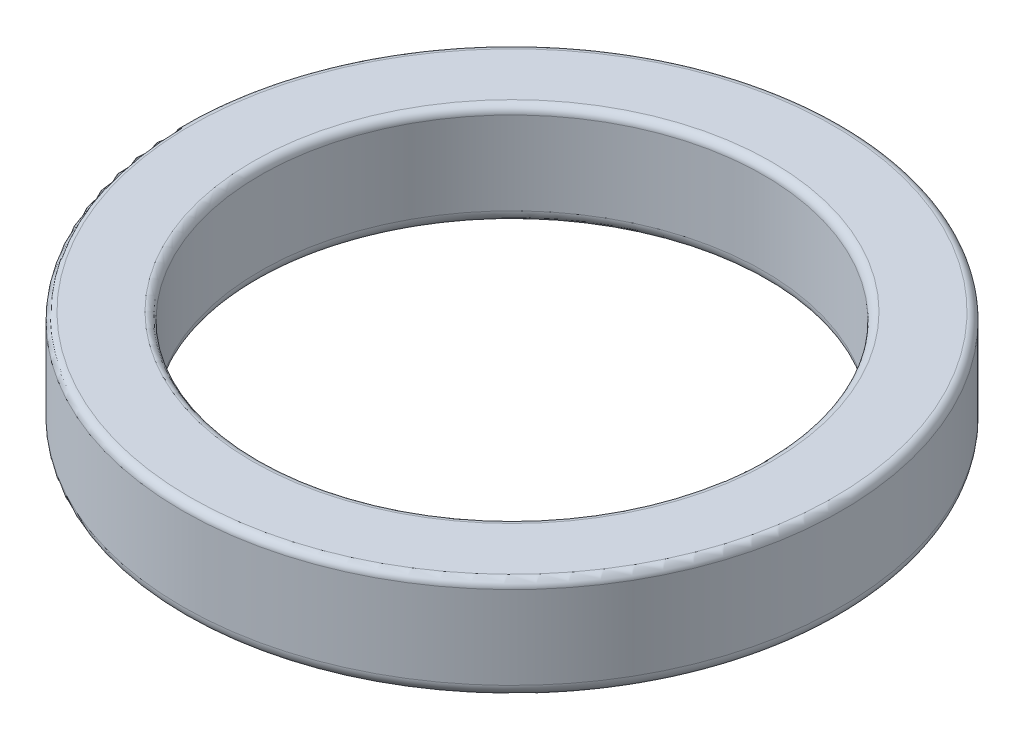
ISO-10303-21;
HEADER;
FILE_DESCRIPTION(('STEP AP214'),'2;1');
FILE_NAME('part.step','',(''),(''),'','','');
FILE_SCHEMA(('AUTOMOTIVE_DESIGN { 1 0 10303 214 1 1 1 1 }'));
ENDSEC;
DATA;
#1=APPLICATION_CONTEXT('core data for automotive mechanical design processes');
#2=APPLICATION_PROTOCOL_DEFINITION('international standard','automotive_design',2000,#1);
#3=PRODUCT_CONTEXT('',#1,'mechanical');
#4=PRODUCT('Part','Part','',(#3));
#5=PRODUCT_RELATED_PRODUCT_CATEGORY('part','',(#4));
#6=PRODUCT_DEFINITION_FORMATION('','',#4);
#7=PRODUCT_DEFINITION_CONTEXT('part definition',#1,'design');
#8=PRODUCT_DEFINITION('design','',#6,#7);
#9=PRODUCT_DEFINITION_SHAPE('','',#8);
#10=(LENGTH_UNIT() NAMED_UNIT(*) SI_UNIT(.MILLI.,.METRE.));
#11=(NAMED_UNIT(*) PLANE_ANGLE_UNIT() SI_UNIT($,.RADIAN.));
#12=(NAMED_UNIT(*) SI_UNIT($,.STERADIAN.) SOLID_ANGLE_UNIT());
#13=UNCERTAINTY_MEASURE_WITH_UNIT(LENGTH_MEASURE(1.E-05),#10,'distance_accuracy_value','');
#14=(GEOMETRIC_REPRESENTATION_CONTEXT(3) GLOBAL_UNCERTAINTY_ASSIGNED_CONTEXT((#13)) GLOBAL_UNIT_ASSIGNED_CONTEXT((#10,
#11,#12)) REPRESENTATION_CONTEXT('',''));
#15=CARTESIAN_POINT('',(0.,0.,0.));
#16=DIRECTION('',(0.,0.,1.));
#17=DIRECTION('',(1.,0.,0.));
#18=AXIS2_PLACEMENT_3D('',#15,#16,#17);
#19=CARTESIAN_POINT('',(0.,4.,0.));
#20=DIRECTION('',(0.,1.,0.));
#21=DIRECTION('',(0.,0.,1.));
#22=AXIS2_PLACEMENT_3D('',#19,#20,#21);
#23=PLANE('',#22);
#24=CARTESIAN_POINT('',(0.,4.,0.));
#25=DIRECTION('',(0.,1.,0.));
#26=DIRECTION('',(0.,0.,1.));
#27=AXIS2_PLACEMENT_3D('',#24,#25,#26);
#28=CIRCLE('',#27,10.00845);
#29=CARTESIAN_POINT('',(0.,4.,10.00845));
#30=VERTEX_POINT('',#29);
#31=EDGE_CURVE('E51',#30,#30,#28,.F.);
#32=ORIENTED_EDGE('',*,*,#31,.T.);
#33=EDGE_LOOP('',(#32));
#34=FACE_BOUND('',#33,.T.);
#35=CARTESIAN_POINT('',(0.,4.,0.));
#36=DIRECTION('',(0.,1.,0.));
#37=DIRECTION('',(0.,0.,1.));
#38=AXIS2_PLACEMENT_3D('',#35,#36,#37);
#39=CIRCLE('',#38,12.40845);
#40=CARTESIAN_POINT('',(0.,4.,12.40845));
#41=VERTEX_POINT('',#40);
#42=EDGE_CURVE('E60',#41,#41,#39,.T.);
#43=ORIENTED_EDGE('',*,*,#42,.T.);
#44=EDGE_LOOP('',(#43));
#45=FACE_BOUND('',#44,.T.);
#46=ADVANCED_FACE('F31',(#34,#45),#23,.T.);
#47=CARTESIAN_POINT('',(0.,0.,0.));
#48=DIRECTION('',(0.,1.,0.));
#49=DIRECTION('',(0.,0.,1.));
#50=AXIS2_PLACEMENT_3D('',#47,#48,#49);
#51=PLANE('',#50);
#52=CARTESIAN_POINT('',(0.,0.,0.));
#53=DIRECTION('',(0.,1.,0.));
#54=DIRECTION('',(0.,0.,1.));
#55=AXIS2_PLACEMENT_3D('',#52,#53,#54);
#56=CIRCLE('',#55,10.20845);
#57=CARTESIAN_POINT('',(0.,0.,10.20845));
#58=VERTEX_POINT('',#57);
#59=EDGE_CURVE('E38',#58,#58,#56,.T.);
#60=ORIENTED_EDGE('',*,*,#59,.T.);
#61=EDGE_LOOP('',(#60));
#62=FACE_BOUND('',#61,.T.);
#63=CARTESIAN_POINT('',(0.,0.,0.));
#64=DIRECTION('',(0.,1.,0.));
#65=DIRECTION('',(0.,0.,1.));
#66=AXIS2_PLACEMENT_3D('',#63,#64,#65);
#67=CIRCLE('',#66,12.20845);
#68=CARTESIAN_POINT('',(0.,0.,12.20845));
#69=VERTEX_POINT('',#68);
#70=EDGE_CURVE('E42',#69,#69,#67,.F.);
#71=ORIENTED_EDGE('',*,*,#70,.T.);
#72=EDGE_LOOP('',(#71));
#73=FACE_BOUND('',#72,.T.);
#74=ADVANCED_FACE('F83',(#62,#73),#51,.F.);
#75=CARTESIAN_POINT('',(0.,4.,0.));
#76=DIRECTION('',(0.,-1.,0.));
#77=DIRECTION('',(0.,0.,-1.));
#78=AXIS2_PLACEMENT_3D('',#75,#76,#77);
#79=CYLINDRICAL_SURFACE('',#78,12.70845);
#80=CARTESIAN_POINT('',(0.,0.5,0.));
#81=DIRECTION('',(0.,1.,0.));
#82=DIRECTION('',(0.,0.,1.));
#83=AXIS2_PLACEMENT_3D('',#80,#81,#82);
#84=CIRCLE('',#83,12.70845);
#85=CARTESIAN_POINT('',(0.,0.5,12.70845));
#86=VERTEX_POINT('',#85);
#87=EDGE_CURVE('E46',#86,#86,#84,.T.);
#88=ORIENTED_EDGE('',*,*,#87,.T.);
#89=EDGE_LOOP('',(#88));
#90=FACE_BOUND('',#89,.T.);
#91=CARTESIAN_POINT('',(0.,3.7,0.));
#92=DIRECTION('',(0.,1.,0.));
#93=DIRECTION('',(0.,0.,1.));
#94=AXIS2_PLACEMENT_3D('',#91,#92,#93);
#95=CIRCLE('',#94,12.70845);
#96=CARTESIAN_POINT('',(0.,3.7,12.70845));
#97=VERTEX_POINT('',#96);
#98=EDGE_CURVE('E57',#97,#97,#95,.F.);
#99=ORIENTED_EDGE('',*,*,#98,.T.);
#100=EDGE_LOOP('',(#99));
#101=FACE_BOUND('',#100,.T.);
#102=ADVANCED_FACE('F78',(#90,#101),#79,.T.);
#103=CARTESIAN_POINT('',(0.,4.,0.));
#104=DIRECTION('',(0.,-1.,0.));
#105=DIRECTION('',(0.,0.,-1.));
#106=AXIS2_PLACEMENT_3D('',#103,#104,#105);
#107=CYLINDRICAL_SURFACE('',#106,9.70845);
#108=CARTESIAN_POINT('',(0.,0.5,0.));
#109=DIRECTION('',(0.,1.,0.));
#110=DIRECTION('',(0.,0.,1.));
#111=AXIS2_PLACEMENT_3D('',#108,#109,#110);
#112=CIRCLE('',#111,9.70845);
#113=CARTESIAN_POINT('',(0.,0.5,9.70845));
#114=VERTEX_POINT('',#113);
#115=EDGE_CURVE('E10',#114,#114,#112,.F.);
#116=ORIENTED_EDGE('',*,*,#115,.T.);
#117=EDGE_LOOP('',(#116));
#118=FACE_BOUND('',#117,.T.);
#119=CARTESIAN_POINT('',(0.,3.7,0.));
#120=DIRECTION('',(0.,1.,0.));
#121=DIRECTION('',(0.,0.,1.));
#122=AXIS2_PLACEMENT_3D('',#119,#120,#121);
#123=CIRCLE('',#122,9.70845);
#124=CARTESIAN_POINT('',(0.,3.7,9.70845));
#125=VERTEX_POINT('',#124);
#126=EDGE_CURVE('E54',#125,#125,#123,.T.);
#127=ORIENTED_EDGE('',*,*,#126,.T.);
#128=EDGE_LOOP('',(#127));
#129=FACE_BOUND('',#128,.T.);
#130=ADVANCED_FACE('F68',(#118,#129),#107,.F.);
#131=CARTESIAN_POINT('',(0.,3.7,0.));
#132=DIRECTION('',(0.,1.,0.));
#133=DIRECTION('',(0.,0.,1.));
#134=AXIS2_PLACEMENT_3D('',#131,#132,#133);
#135=TOROIDAL_SURFACE('',#134,12.40845,0.3);
#136=ORIENTED_EDGE('',*,*,#98,.F.);
#137=EDGE_LOOP('',(#136));
#138=FACE_BOUND('',#137,.T.);
#139=ORIENTED_EDGE('',*,*,#42,.F.);
#140=EDGE_LOOP('',(#139));
#141=FACE_BOUND('',#140,.T.);
#142=ADVANCED_FACE('F65',(#138,#141),#135,.T.);
#143=CARTESIAN_POINT('',(0.,3.7,0.));
#144=DIRECTION('',(0.,1.,0.));
#145=DIRECTION('',(0.,0.,1.));
#146=AXIS2_PLACEMENT_3D('',#143,#144,#145);
#147=TOROIDAL_SURFACE('',#146,10.00845,0.3);
#148=ORIENTED_EDGE('',*,*,#31,.F.);
#149=EDGE_LOOP('',(#148));
#150=FACE_BOUND('',#149,.T.);
#151=ORIENTED_EDGE('',*,*,#126,.F.);
#152=EDGE_LOOP('',(#151));
#153=FACE_BOUND('',#152,.T.);
#154=ADVANCED_FACE('F67',(#150,#153),#147,.T.);
#155=CARTESIAN_POINT('',(0.,0.5,0.));
#156=DIRECTION('',(0.,1.,0.));
#157=DIRECTION('',(0.,0.,1.));
#158=AXIS2_PLACEMENT_3D('',#155,#156,#157);
#159=TOROIDAL_SURFACE('',#158,12.20845,0.5);
#160=ORIENTED_EDGE('',*,*,#70,.F.);
#161=EDGE_LOOP('',(#160));
#162=FACE_BOUND('',#161,.T.);
#163=ORIENTED_EDGE('',*,*,#87,.F.);
#164=EDGE_LOOP('',(#163));
#165=FACE_BOUND('',#164,.T.);
#166=ADVANCED_FACE('F75',(#162,#165),#159,.T.);
#167=CARTESIAN_POINT('',(0.,0.5,0.));
#168=DIRECTION('',(0.,1.,0.));
#169=DIRECTION('',(0.,0.,1.));
#170=AXIS2_PLACEMENT_3D('',#167,#168,#169);
#171=TOROIDAL_SURFACE('',#170,10.20845,0.5);
#172=ORIENTED_EDGE('',*,*,#115,.F.);
#173=EDGE_LOOP('',(#172));
#174=FACE_BOUND('',#173,.T.);
#175=ORIENTED_EDGE('',*,*,#59,.F.);
#176=EDGE_LOOP('',(#175));
#177=FACE_BOUND('',#176,.T.);
#178=ADVANCED_FACE('F33',(#174,#177),#171,.T.);
#179=CLOSED_SHELL('',(#46,#74,#102,#130,#142,#154,#166,#178));
#180=MANIFOLD_SOLID_BREP('B2',#179);
#181=ADVANCED_BREP_SHAPE_REPRESENTATION('',(#18,#180),#14);
#182=SHAPE_DEFINITION_REPRESENTATION(#9,#181);
ENDSEC;
END-ISO-10303-21;
